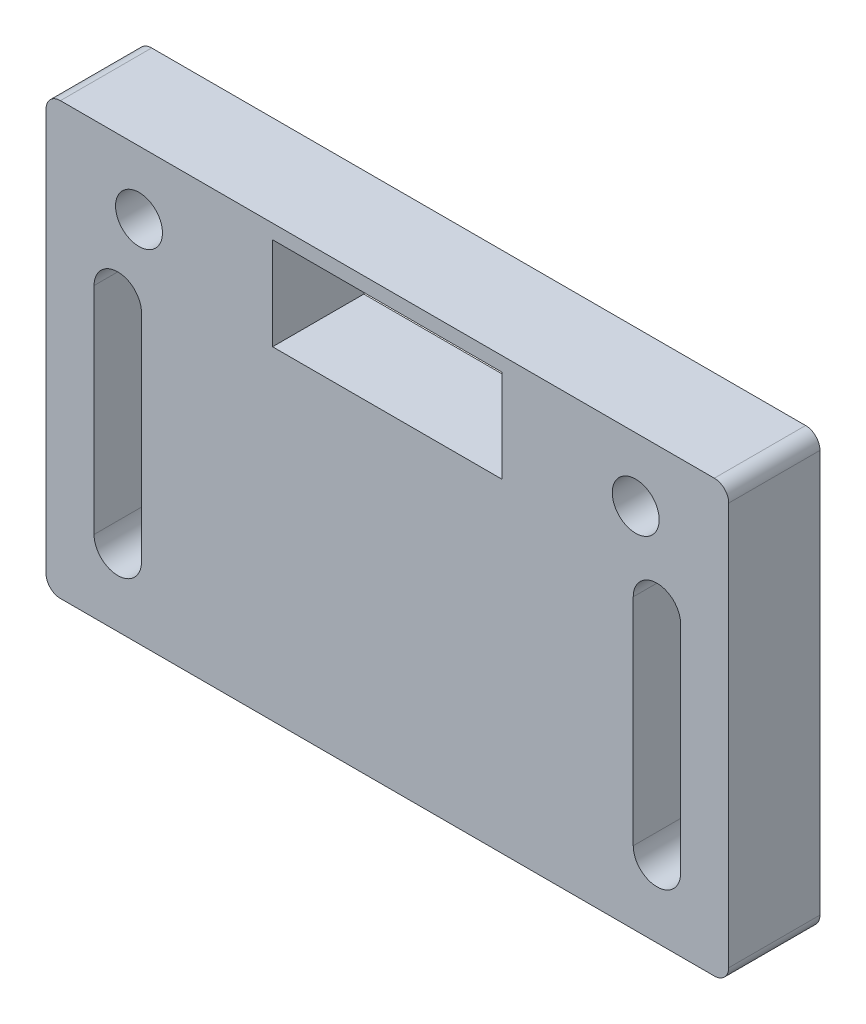
ISO-10303-21;
HEADER;
FILE_DESCRIPTION(('STEP AP214'),'2;1');
FILE_NAME('part.step','',(''),(''),'','','');
FILE_SCHEMA(('AUTOMOTIVE_DESIGN { 1 0 10303 214 1 1 1 1 }'));
ENDSEC;
DATA;
#1=APPLICATION_CONTEXT('core data for automotive mechanical design processes');
#2=APPLICATION_PROTOCOL_DEFINITION('international standard','automotive_design',2000,#1);
#3=PRODUCT_CONTEXT('',#1,'mechanical');
#4=PRODUCT('Part','Part','',(#3));
#5=PRODUCT_RELATED_PRODUCT_CATEGORY('part','',(#4));
#6=PRODUCT_DEFINITION_FORMATION('','',#4);
#7=PRODUCT_DEFINITION_CONTEXT('part definition',#1,'design');
#8=PRODUCT_DEFINITION('design','',#6,#7);
#9=PRODUCT_DEFINITION_SHAPE('','',#8);
#10=(LENGTH_UNIT() NAMED_UNIT(*) SI_UNIT(.MILLI.,.METRE.));
#11=(NAMED_UNIT(*) PLANE_ANGLE_UNIT() SI_UNIT($,.RADIAN.));
#12=(NAMED_UNIT(*) SI_UNIT($,.STERADIAN.) SOLID_ANGLE_UNIT());
#13=UNCERTAINTY_MEASURE_WITH_UNIT(LENGTH_MEASURE(1.E-05),#10,'distance_accuracy_value','');
#14=(GEOMETRIC_REPRESENTATION_CONTEXT(3) GLOBAL_UNCERTAINTY_ASSIGNED_CONTEXT((#13)) GLOBAL_UNIT_ASSIGNED_CONTEXT((#10,
#11,#12)) REPRESENTATION_CONTEXT('',''));
#15=CARTESIAN_POINT('',(0.,0.,0.));
#16=DIRECTION('',(0.,0.,1.));
#17=DIRECTION('',(1.,0.,0.));
#18=AXIS2_PLACEMENT_3D('',#15,#16,#17);
#19=CARTESIAN_POINT('',(0.,0.,0.));
#20=DIRECTION('',(0.,0.,1.));
#21=DIRECTION('',(1.,0.,0.));
#22=AXIS2_PLACEMENT_3D('',#19,#20,#21);
#23=PLANE('',#22);
#24=CARTESIAN_POINT('',(37.515,-19.9408597898144,0.));
#25=DIRECTION('',(0.,0.,-1.));
#26=DIRECTION('',(-1.,0.,0.));
#27=AXIS2_PLACEMENT_3D('',#24,#25,#26);
#28=CIRCLE('',#27,3.3);
#29=CARTESIAN_POINT('',(34.215,-19.9408597898144,0.));
#30=VERTEX_POINT('',#29);
#31=CARTESIAN_POINT('',(40.815,-19.9408597898144,0.));
#32=VERTEX_POINT('',#31);
#33=EDGE_CURVE('E203',#30,#32,#28,.T.);
#34=ORIENTED_EDGE('',*,*,#33,.F.);
#35=DIRECTION('',(0.,1.,0.));
#36=VECTOR('',#35,1.);
#37=CARTESIAN_POINT('',(34.215,0.,0.));
#38=LINE('',#37,#36);
#39=CARTESIAN_POINT('',(34.215,-49.9408597898144,0.));
#40=VERTEX_POINT('',#39);
#41=EDGE_CURVE('E52',#40,#30,#38,.T.);
#42=ORIENTED_EDGE('',*,*,#41,.F.);
#43=CARTESIAN_POINT('',(37.515,-49.9408597898144,0.));
#44=DIRECTION('',(0.,0.,-1.));
#45=DIRECTION('',(-1.,0.,0.));
#46=AXIS2_PLACEMENT_3D('',#43,#44,#45);
#47=CIRCLE('',#46,3.3);
#48=CARTESIAN_POINT('',(40.815,-49.9408597898144,0.));
#49=VERTEX_POINT('',#48);
#50=EDGE_CURVE('E194',#40,#49,#47,.F.);
#51=ORIENTED_EDGE('',*,*,#50,.T.);
#52=DIRECTION('',(0.,-1.,0.));
#53=VECTOR('',#52,1.);
#54=CARTESIAN_POINT('',(40.815,0.,0.));
#55=LINE('',#54,#53);
#56=EDGE_CURVE('E197',#32,#49,#55,.T.);
#57=ORIENTED_EDGE('',*,*,#56,.F.);
#58=EDGE_LOOP('',(#34,#42,#51,#57));
#59=FACE_BOUND('',#58,.T.);
#60=CARTESIAN_POINT('',(-37.515,-19.9408597898144,0.));
#61=DIRECTION('',(0.,0.,-1.));
#62=DIRECTION('',(-1.,0.,0.));
#63=AXIS2_PLACEMENT_3D('',#60,#61,#62);
#64=CIRCLE('',#63,3.3);
#65=CARTESIAN_POINT('',(-40.815,-19.9408597898144,0.));
#66=VERTEX_POINT('',#65);
#67=CARTESIAN_POINT('',(-34.215,-19.9408597898144,0.));
#68=VERTEX_POINT('',#67);
#69=EDGE_CURVE('E229',#66,#68,#64,.T.);
#70=ORIENTED_EDGE('',*,*,#69,.F.);
#71=DIRECTION('',(0.,1.,0.));
#72=VECTOR('',#71,1.);
#73=CARTESIAN_POINT('',(-40.815,0.,0.));
#74=LINE('',#73,#72);
#75=CARTESIAN_POINT('',(-40.815,-49.9408597898144,0.));
#76=VERTEX_POINT('',#75);
#77=EDGE_CURVE('E60',#76,#66,#74,.T.);
#78=ORIENTED_EDGE('',*,*,#77,.F.);
#79=CARTESIAN_POINT('',(-37.515,-49.9408597898144,0.));
#80=DIRECTION('',(0.,0.,-1.));
#81=DIRECTION('',(-1.,0.,0.));
#82=AXIS2_PLACEMENT_3D('',#79,#80,#81);
#83=CIRCLE('',#82,3.3);
#84=CARTESIAN_POINT('',(-34.215,-49.9408597898144,0.));
#85=VERTEX_POINT('',#84);
#86=EDGE_CURVE('E218',#85,#76,#83,.T.);
#87=ORIENTED_EDGE('',*,*,#86,.F.);
#88=DIRECTION('',(0.,1.,0.));
#89=VECTOR('',#88,1.);
#90=CARTESIAN_POINT('',(-34.215,0.,0.));
#91=LINE('',#90,#89);
#92=EDGE_CURVE('E232',#85,#68,#91,.T.);
#93=ORIENTED_EDGE('',*,*,#92,.T.);
#94=EDGE_LOOP('',(#70,#78,#87,#93));
#95=FACE_BOUND('',#94,.T.);
#96=CARTESIAN_POINT('',(34.56,-8.84508661523853,0.));
#97=DIRECTION('',(0.,0.,-1.));
#98=DIRECTION('',(-1.,0.,0.));
#99=AXIS2_PLACEMENT_3D('',#96,#97,#98);
#100=CIRCLE('',#99,6.4389);
#101=CARTESIAN_POINT('',(28.1211,-8.84508661523853,0.));
#102=VERTEX_POINT('',#101);
#103=EDGE_CURVE('E210',#102,#102,#100,.T.);
#104=ORIENTED_EDGE('',*,*,#103,.F.);
#105=EDGE_LOOP('',(#104));
#106=FACE_BOUND('',#105,.T.);
#107=DIRECTION('',(0.,1.,0.));
#108=VECTOR('',#107,1.);
#109=CARTESIAN_POINT('',(47.5,0.,0.));
#110=LINE('',#109,#108);
#111=CARTESIAN_POINT('',(47.5,-58.,0.));
#112=VERTEX_POINT('',#111);
#113=CARTESIAN_POINT('',(47.5,-2.,0.));
#114=VERTEX_POINT('',#113);
#115=EDGE_CURVE('E308',#112,#114,#110,.T.);
#116=ORIENTED_EDGE('',*,*,#115,.F.);
#117=CARTESIAN_POINT('',(45.5,-58.,0.));
#118=DIRECTION('',(0.,0.,1.));
#119=DIRECTION('',(1.,0.,0.));
#120=AXIS2_PLACEMENT_3D('',#117,#118,#119);
#121=CIRCLE('',#120,2.);
#122=CARTESIAN_POINT('',(45.5,-60.,0.));
#123=VERTEX_POINT('',#122);
#124=EDGE_CURVE('E338',#112,#123,#121,.F.);
#125=ORIENTED_EDGE('',*,*,#124,.T.);
#126=DIRECTION('',(1.,0.,0.));
#127=VECTOR('',#126,1.);
#128=CARTESIAN_POINT('',(-47.5,-60.,0.));
#129=LINE('',#128,#127);
#130=CARTESIAN_POINT('',(-45.5,-60.,0.));
#131=VERTEX_POINT('',#130);
#132=EDGE_CURVE('E305',#131,#123,#129,.T.);
#133=ORIENTED_EDGE('',*,*,#132,.F.);
#134=CARTESIAN_POINT('',(-45.5,-58.,0.));
#135=DIRECTION('',(0.,0.,1.));
#136=DIRECTION('',(1.,0.,0.));
#137=AXIS2_PLACEMENT_3D('',#134,#135,#136);
#138=CIRCLE('',#137,2.);
#139=CARTESIAN_POINT('',(-47.5,-58.,0.));
#140=VERTEX_POINT('',#139);
#141=EDGE_CURVE('E316',#131,#140,#138,.F.);
#142=ORIENTED_EDGE('',*,*,#141,.T.);
#143=DIRECTION('',(0.,-1.,0.));
#144=VECTOR('',#143,1.);
#145=CARTESIAN_POINT('',(-47.5,0.,0.));
#146=LINE('',#145,#144);
#147=CARTESIAN_POINT('',(-47.5,-2.,0.));
#148=VERTEX_POINT('',#147);
#149=EDGE_CURVE('E289',#148,#140,#146,.T.);
#150=ORIENTED_EDGE('',*,*,#149,.F.);
#151=CARTESIAN_POINT('',(-45.5,-2.,0.));
#152=DIRECTION('',(0.,0.,1.));
#153=DIRECTION('',(1.,0.,0.));
#154=AXIS2_PLACEMENT_3D('',#151,#152,#153);
#155=CIRCLE('',#154,2.);
#156=CARTESIAN_POINT('',(-45.5,0.,0.));
#157=VERTEX_POINT('',#156);
#158=EDGE_CURVE('E318',#148,#157,#155,.F.);
#159=ORIENTED_EDGE('',*,*,#158,.T.);
#160=DIRECTION('',(-1.,0.,0.));
#161=VECTOR('',#160,1.);
#162=CARTESIAN_POINT('',(-47.5,0.,0.));
#163=LINE('',#162,#161);
#164=CARTESIAN_POINT('',(45.5,0.,0.));
#165=VERTEX_POINT('',#164);
#166=EDGE_CURVE('E294',#165,#157,#163,.T.);
#167=ORIENTED_EDGE('',*,*,#166,.F.);
#168=CARTESIAN_POINT('',(45.5,-2.,0.));
#169=DIRECTION('',(0.,0.,1.));
#170=DIRECTION('',(1.,0.,0.));
#171=AXIS2_PLACEMENT_3D('',#168,#169,#170);
#172=CIRCLE('',#171,2.);
#173=EDGE_CURVE('E336',#165,#114,#172,.F.);
#174=ORIENTED_EDGE('',*,*,#173,.T.);
#175=EDGE_LOOP('',(#116,#125,#133,#142,#150,#159,#167,#174));
#176=FACE_BOUND('',#175,.T.);
#177=DIRECTION('',(0.,-1.,0.));
#178=VECTOR('',#177,1.);
#179=CARTESIAN_POINT('',(-15.975,-14.9,0.));
#180=LINE('',#179,#178);
#181=CARTESIAN_POINT('',(-15.975,-2.,0.));
#182=VERTEX_POINT('',#181);
#183=CARTESIAN_POINT('',(-15.975,-14.9,0.));
#184=VERTEX_POINT('',#183);
#185=EDGE_CURVE('E260',#182,#184,#180,.T.);
#186=ORIENTED_EDGE('',*,*,#185,.T.);
#187=DIRECTION('',(1.,0.,0.));
#188=VECTOR('',#187,1.);
#189=CARTESIAN_POINT('',(15.975,-14.9,0.));
#190=LINE('',#189,#188);
#191=CARTESIAN_POINT('',(15.975,-14.9,0.));
#192=VERTEX_POINT('',#191);
#193=EDGE_CURVE('E274',#184,#192,#190,.T.);
#194=ORIENTED_EDGE('',*,*,#193,.T.);
#195=DIRECTION('',(0.,1.,0.));
#196=VECTOR('',#195,1.);
#197=CARTESIAN_POINT('',(15.975,-2.,0.));
#198=LINE('',#197,#196);
#199=CARTESIAN_POINT('',(15.975,-2.,0.));
#200=VERTEX_POINT('',#199);
#201=EDGE_CURVE('E277',#192,#200,#198,.T.);
#202=ORIENTED_EDGE('',*,*,#201,.T.);
#203=DIRECTION('',(-1.,0.,0.));
#204=VECTOR('',#203,1.);
#205=CARTESIAN_POINT('',(0.,-2.,0.));
#206=LINE('',#205,#204);
#207=EDGE_CURVE('E264',#200,#182,#206,.T.);
#208=ORIENTED_EDGE('',*,*,#207,.T.);
#209=EDGE_LOOP('',(#186,#194,#202,#208));
#210=FACE_BOUND('',#209,.T.);
#211=CARTESIAN_POINT('',(-34.56,-8.84508661523853,0.));
#212=DIRECTION('',(0.,0.,-1.));
#213=DIRECTION('',(-1.,0.,0.));
#214=AXIS2_PLACEMENT_3D('',#211,#212,#213);
#215=CIRCLE('',#214,6.4389);
#216=CARTESIAN_POINT('',(-40.9989,-8.84508661523853,0.));
#217=VERTEX_POINT('',#216);
#218=EDGE_CURVE('E251',#217,#217,#215,.T.);
#219=ORIENTED_EDGE('',*,*,#218,.F.);
#220=EDGE_LOOP('',(#219));
#221=FACE_BOUND('',#220,.T.);
#222=ADVANCED_FACE('F37',(#59,#95,#106,#176,#210,#221),#23,.F.);
#223=CARTESIAN_POINT('',(0.,0.,12.7));
#224=DIRECTION('',(0.,0.,1.));
#225=DIRECTION('',(1.,0.,0.));
#226=AXIS2_PLACEMENT_3D('',#223,#224,#225);
#227=PLANE('',#226);
#228=DIRECTION('',(0.,1.,0.));
#229=VECTOR('',#228,1.);
#230=CARTESIAN_POINT('',(34.215,0.,12.7));
#231=LINE('',#230,#229);
#232=CARTESIAN_POINT('',(34.215,-49.9408597898144,12.7));
#233=VERTEX_POINT('',#232);
#234=CARTESIAN_POINT('',(34.215,-19.9408597898144,12.7));
#235=VERTEX_POINT('',#234);
#236=EDGE_CURVE('E176',#233,#235,#231,.T.);
#237=ORIENTED_EDGE('',*,*,#236,.T.);
#238=CARTESIAN_POINT('',(37.515,-19.9408597898144,12.7));
#239=DIRECTION('',(0.,0.,-1.));
#240=DIRECTION('',(-1.,0.,0.));
#241=AXIS2_PLACEMENT_3D('',#238,#239,#240);
#242=CIRCLE('',#241,3.3);
#243=CARTESIAN_POINT('',(40.815,-19.9408597898144,12.7));
#244=VERTEX_POINT('',#243);
#245=EDGE_CURVE('E186',#235,#244,#242,.T.);
#246=ORIENTED_EDGE('',*,*,#245,.T.);
#247=DIRECTION('',(0.,-1.,0.));
#248=VECTOR('',#247,1.);
#249=CARTESIAN_POINT('',(40.815,0.,12.7));
#250=LINE('',#249,#248);
#251=CARTESIAN_POINT('',(40.815,-49.9408597898144,12.7));
#252=VERTEX_POINT('',#251);
#253=EDGE_CURVE('E190',#244,#252,#250,.T.);
#254=ORIENTED_EDGE('',*,*,#253,.T.);
#255=CARTESIAN_POINT('',(37.515,-49.9408597898144,12.7));
#256=DIRECTION('',(0.,0.,-1.));
#257=DIRECTION('',(-1.,0.,0.));
#258=AXIS2_PLACEMENT_3D('',#255,#256,#257);
#259=CIRCLE('',#258,3.3);
#260=EDGE_CURVE('E182',#233,#252,#259,.F.);
#261=ORIENTED_EDGE('',*,*,#260,.F.);
#262=EDGE_LOOP('',(#237,#246,#254,#261));
#263=FACE_BOUND('',#262,.T.);
#264=DIRECTION('',(0.,1.,0.));
#265=VECTOR('',#264,1.);
#266=CARTESIAN_POINT('',(-40.815,0.,12.7));
#267=LINE('',#266,#265);
#268=CARTESIAN_POINT('',(-40.815,-49.9408597898144,12.7));
#269=VERTEX_POINT('',#268);
#270=CARTESIAN_POINT('',(-40.815,-19.9408597898144,12.7));
#271=VERTEX_POINT('',#270);
#272=EDGE_CURVE('E214',#269,#271,#267,.T.);
#273=ORIENTED_EDGE('',*,*,#272,.T.);
#274=CARTESIAN_POINT('',(-37.515,-19.9408597898144,12.7));
#275=DIRECTION('',(0.,0.,-1.));
#276=DIRECTION('',(-1.,0.,0.));
#277=AXIS2_PLACEMENT_3D('',#274,#275,#276);
#278=CIRCLE('',#277,3.3);
#279=CARTESIAN_POINT('',(-34.215,-19.9408597898144,12.7));
#280=VERTEX_POINT('',#279);
#281=EDGE_CURVE('E217',#271,#280,#278,.T.);
#282=ORIENTED_EDGE('',*,*,#281,.T.);
#283=DIRECTION('',(0.,1.,0.));
#284=VECTOR('',#283,1.);
#285=CARTESIAN_POINT('',(-34.215,0.,12.7));
#286=LINE('',#285,#284);
#287=CARTESIAN_POINT('',(-34.215,-49.9408597898144,12.7));
#288=VERTEX_POINT('',#287);
#289=EDGE_CURVE('E221',#288,#280,#286,.T.);
#290=ORIENTED_EDGE('',*,*,#289,.F.);
#291=CARTESIAN_POINT('',(-37.515,-49.9408597898144,12.7));
#292=DIRECTION('',(0.,0.,-1.));
#293=DIRECTION('',(-1.,0.,0.));
#294=AXIS2_PLACEMENT_3D('',#291,#292,#293);
#295=CIRCLE('',#294,3.3);
#296=EDGE_CURVE('E224',#288,#269,#295,.T.);
#297=ORIENTED_EDGE('',*,*,#296,.T.);
#298=EDGE_LOOP('',(#273,#282,#290,#297));
#299=FACE_BOUND('',#298,.T.);
#300=CARTESIAN_POINT('',(34.56,-8.84508661523853,12.7));
#301=DIRECTION('',(0.,0.,-1.));
#302=DIRECTION('',(-1.,0.,0.));
#303=AXIS2_PLACEMENT_3D('',#300,#301,#302);
#304=CIRCLE('',#303,3.26389999999999);
#305=CARTESIAN_POINT('',(31.2961,-8.84508661523853,12.7));
#306=VERTEX_POINT('',#305);
#307=EDGE_CURVE('E248',#306,#306,#304,.T.);
#308=ORIENTED_EDGE('',*,*,#307,.T.);
#309=EDGE_LOOP('',(#308));
#310=FACE_BOUND('',#309,.T.);
#311=CARTESIAN_POINT('',(-34.56,-8.84508661523853,12.7));
#312=DIRECTION('',(0.,0.,-1.));
#313=DIRECTION('',(-1.,0.,0.));
#314=AXIS2_PLACEMENT_3D('',#311,#312,#313);
#315=CIRCLE('',#314,3.26389999999999);
#316=CARTESIAN_POINT('',(-37.8239,-8.84508661523853,12.7));
#317=VERTEX_POINT('',#316);
#318=EDGE_CURVE('E257',#317,#317,#315,.T.);
#319=ORIENTED_EDGE('',*,*,#318,.T.);
#320=EDGE_LOOP('',(#319));
#321=FACE_BOUND('',#320,.T.);
#322=DIRECTION('',(1.,0.,0.));
#323=VECTOR('',#322,1.);
#324=CARTESIAN_POINT('',(-47.5,-60.,12.7));
#325=LINE('',#324,#323);
#326=CARTESIAN_POINT('',(-45.5,-60.,12.7));
#327=VERTEX_POINT('',#326);
#328=CARTESIAN_POINT('',(45.5,-60.,12.7));
#329=VERTEX_POINT('',#328);
#330=EDGE_CURVE('E293',#327,#329,#325,.T.);
#331=ORIENTED_EDGE('',*,*,#330,.T.);
#332=CARTESIAN_POINT('',(45.5,-58.,12.7));
#333=DIRECTION('',(0.,0.,1.));
#334=DIRECTION('',(1.,0.,0.));
#335=AXIS2_PLACEMENT_3D('',#332,#333,#334);
#336=CIRCLE('',#335,2.);
#337=CARTESIAN_POINT('',(47.5,-58.,12.7));
#338=VERTEX_POINT('',#337);
#339=EDGE_CURVE('E45',#329,#338,#336,.T.);
#340=ORIENTED_EDGE('',*,*,#339,.T.);
#341=DIRECTION('',(0.,1.,0.));
#342=VECTOR('',#341,1.);
#343=CARTESIAN_POINT('',(47.5,0.,12.7));
#344=LINE('',#343,#342);
#345=CARTESIAN_POINT('',(47.5,-2.,12.7));
#346=VERTEX_POINT('',#345);
#347=EDGE_CURVE('E297',#338,#346,#344,.T.);
#348=ORIENTED_EDGE('',*,*,#347,.T.);
#349=CARTESIAN_POINT('',(45.5,-2.,12.7));
#350=DIRECTION('',(0.,0.,1.));
#351=DIRECTION('',(1.,0.,0.));
#352=AXIS2_PLACEMENT_3D('',#349,#350,#351);
#353=CIRCLE('',#352,2.);
#354=CARTESIAN_POINT('',(45.5,0.,12.7));
#355=VERTEX_POINT('',#354);
#356=EDGE_CURVE('E342',#346,#355,#353,.T.);
#357=ORIENTED_EDGE('',*,*,#356,.T.);
#358=DIRECTION('',(-1.,0.,0.));
#359=VECTOR('',#358,1.);
#360=CARTESIAN_POINT('',(-47.5,0.,12.7));
#361=LINE('',#360,#359);
#362=CARTESIAN_POINT('',(-45.5,0.,12.7));
#363=VERTEX_POINT('',#362);
#364=EDGE_CURVE('E300',#355,#363,#361,.T.);
#365=ORIENTED_EDGE('',*,*,#364,.T.);
#366=CARTESIAN_POINT('',(-45.5,-2.,12.7));
#367=DIRECTION('',(0.,0.,1.));
#368=DIRECTION('',(1.,0.,0.));
#369=AXIS2_PLACEMENT_3D('',#366,#367,#368);
#370=CIRCLE('',#369,2.);
#371=CARTESIAN_POINT('',(-47.5,-2.,12.7));
#372=VERTEX_POINT('',#371);
#373=EDGE_CURVE('E326',#363,#372,#370,.T.);
#374=ORIENTED_EDGE('',*,*,#373,.T.);
#375=DIRECTION('',(0.,-1.,0.));
#376=VECTOR('',#375,1.);
#377=CARTESIAN_POINT('',(-47.5,0.,12.7));
#378=LINE('',#377,#376);
#379=CARTESIAN_POINT('',(-47.5,-58.,12.7));
#380=VERTEX_POINT('',#379);
#381=EDGE_CURVE('E290',#372,#380,#378,.T.);
#382=ORIENTED_EDGE('',*,*,#381,.T.);
#383=CARTESIAN_POINT('',(-45.5,-58.,12.7));
#384=DIRECTION('',(0.,0.,1.));
#385=DIRECTION('',(1.,0.,0.));
#386=AXIS2_PLACEMENT_3D('',#383,#384,#385);
#387=CIRCLE('',#386,2.);
#388=EDGE_CURVE('E324',#380,#327,#387,.T.);
#389=ORIENTED_EDGE('',*,*,#388,.T.);
#390=EDGE_LOOP('',(#331,#340,#348,#357,#365,#374,#382,#389));
#391=FACE_BOUND('',#390,.T.);
#392=DIRECTION('',(1.,0.,0.));
#393=VECTOR('',#392,1.);
#394=CARTESIAN_POINT('',(15.975,-14.9,12.7));
#395=LINE('',#394,#393);
#396=CARTESIAN_POINT('',(-15.975,-14.9,12.7));
#397=VERTEX_POINT('',#396);
#398=CARTESIAN_POINT('',(15.975,-14.9,12.7));
#399=VERTEX_POINT('',#398);
#400=EDGE_CURVE('E266',#397,#399,#395,.T.);
#401=ORIENTED_EDGE('',*,*,#400,.F.);
#402=DIRECTION('',(0.,-1.,0.));
#403=VECTOR('',#402,1.);
#404=CARTESIAN_POINT('',(-15.975,-14.9,12.7));
#405=LINE('',#404,#403);
#406=CARTESIAN_POINT('',(-15.975,-2.,12.7));
#407=VERTEX_POINT('',#406);
#408=EDGE_CURVE('E263',#407,#397,#405,.T.);
#409=ORIENTED_EDGE('',*,*,#408,.F.);
#410=DIRECTION('',(-1.,0.,0.));
#411=VECTOR('',#410,1.);
#412=CARTESIAN_POINT('',(-15.975,-2.,12.7));
#413=LINE('',#412,#411);
#414=CARTESIAN_POINT('',(15.975,-2.,12.7));
#415=VERTEX_POINT('',#414);
#416=EDGE_CURVE('E261',#415,#407,#413,.T.);
#417=ORIENTED_EDGE('',*,*,#416,.F.);
#418=DIRECTION('',(0.,1.,0.));
#419=VECTOR('',#418,1.);
#420=CARTESIAN_POINT('',(15.975,-2.,12.7));
#421=LINE('',#420,#419);
#422=EDGE_CURVE('E268',#399,#415,#421,.T.);
#423=ORIENTED_EDGE('',*,*,#422,.F.);
#424=EDGE_LOOP('',(#401,#409,#417,#423));
#425=FACE_BOUND('',#424,.T.);
#426=ADVANCED_FACE('F192',(#263,#299,#310,#321,#391,#425),#227,.T.);
#427=CARTESIAN_POINT('',(-47.5,0.,12.7));
#428=DIRECTION('',(1.,0.,0.));
#429=DIRECTION('',(0.,1.,0.));
#430=AXIS2_PLACEMENT_3D('',#427,#428,#429);
#431=PLANE('',#430);
#432=ORIENTED_EDGE('',*,*,#381,.F.);
#433=DIRECTION('',(0.,0.,-1.));
#434=VECTOR('',#433,1.);
#435=CARTESIAN_POINT('',(-47.5,-2.,12.7));
#436=LINE('',#435,#434);
#437=EDGE_CURVE('E313',#372,#148,#436,.T.);
#438=ORIENTED_EDGE('',*,*,#437,.T.);
#439=ORIENTED_EDGE('',*,*,#149,.T.);
#440=DIRECTION('',(0.,0.,-1.));
#441=VECTOR('',#440,1.);
#442=CARTESIAN_POINT('',(-47.5,-58.,12.7));
#443=LINE('',#442,#441);
#444=EDGE_CURVE('E302',#140,#380,#443,.F.);
#445=ORIENTED_EDGE('',*,*,#444,.T.);
#446=EDGE_LOOP('',(#432,#438,#439,#445));
#447=FACE_BOUND('',#446,.T.);
#448=ADVANCED_FACE('F370',(#447),#431,.F.);
#449=CARTESIAN_POINT('',(-47.5,-60.,12.7));
#450=DIRECTION('',(0.,1.,0.));
#451=DIRECTION('',(0.,0.,1.));
#452=AXIS2_PLACEMENT_3D('',#449,#450,#451);
#453=PLANE('',#452);
#454=ORIENTED_EDGE('',*,*,#132,.T.);
#455=DIRECTION('',(0.,0.,-1.));
#456=VECTOR('',#455,1.);
#457=CARTESIAN_POINT('',(45.5,-60.,12.7));
#458=LINE('',#457,#456);
#459=EDGE_CURVE('E340',#123,#329,#458,.F.);
#460=ORIENTED_EDGE('',*,*,#459,.T.);
#461=ORIENTED_EDGE('',*,*,#330,.F.);
#462=DIRECTION('',(0.,0.,-1.));
#463=VECTOR('',#462,1.);
#464=CARTESIAN_POINT('',(-45.5,-60.,12.7));
#465=LINE('',#464,#463);
#466=EDGE_CURVE('E328',#327,#131,#465,.T.);
#467=ORIENTED_EDGE('',*,*,#466,.T.);
#468=EDGE_LOOP('',(#454,#460,#461,#467));
#469=FACE_BOUND('',#468,.T.);
#470=ADVANCED_FACE('F361',(#469),#453,.F.);
#471=CARTESIAN_POINT('',(47.5,0.,12.7));
#472=DIRECTION('',(-1.,0.,0.));
#473=DIRECTION('',(0.,-1.,0.));
#474=AXIS2_PLACEMENT_3D('',#471,#472,#473);
#475=PLANE('',#474);
#476=ORIENTED_EDGE('',*,*,#347,.F.);
#477=DIRECTION('',(0.,0.,-1.));
#478=VECTOR('',#477,1.);
#479=CARTESIAN_POINT('',(47.5,-58.,12.7));
#480=LINE('',#479,#478);
#481=EDGE_CURVE('E333',#338,#112,#480,.T.);
#482=ORIENTED_EDGE('',*,*,#481,.T.);
#483=ORIENTED_EDGE('',*,*,#115,.T.);
#484=DIRECTION('',(0.,0.,-1.));
#485=VECTOR('',#484,1.);
#486=CARTESIAN_POINT('',(47.5,-2.,12.7));
#487=LINE('',#486,#485);
#488=EDGE_CURVE('E331',#114,#346,#487,.F.);
#489=ORIENTED_EDGE('',*,*,#488,.T.);
#490=EDGE_LOOP('',(#476,#482,#483,#489));
#491=FACE_BOUND('',#490,.T.);
#492=ADVANCED_FACE('F353',(#491),#475,.F.);
#493=CARTESIAN_POINT('',(-47.5,0.,12.7));
#494=DIRECTION('',(0.,-1.,0.));
#495=DIRECTION('',(0.,0.,-1.));
#496=AXIS2_PLACEMENT_3D('',#493,#494,#495);
#497=PLANE('',#496);
#498=ORIENTED_EDGE('',*,*,#364,.F.);
#499=DIRECTION('',(0.,0.,-1.));
#500=VECTOR('',#499,1.);
#501=CARTESIAN_POINT('',(45.5,0.,12.7));
#502=LINE('',#501,#500);
#503=EDGE_CURVE('E11',#355,#165,#502,.T.);
#504=ORIENTED_EDGE('',*,*,#503,.T.);
#505=ORIENTED_EDGE('',*,*,#166,.T.);
#506=DIRECTION('',(0.,0.,-1.));
#507=VECTOR('',#506,1.);
#508=CARTESIAN_POINT('',(-45.5,0.,12.7));
#509=LINE('',#508,#507);
#510=EDGE_CURVE('E321',#157,#363,#509,.F.);
#511=ORIENTED_EDGE('',*,*,#510,.T.);
#512=EDGE_LOOP('',(#498,#504,#505,#511));
#513=FACE_BOUND('',#512,.T.);
#514=ADVANCED_FACE('F379',(#513),#497,.F.);
#515=CARTESIAN_POINT('',(-15.975,-14.9,12.7));
#516=DIRECTION('',(1.,0.,0.));
#517=DIRECTION('',(0.,0.,-1.));
#518=AXIS2_PLACEMENT_3D('',#515,#516,#517);
#519=PLANE('',#518);
#520=ORIENTED_EDGE('',*,*,#185,.F.);
#521=DIRECTION('',(0.,0.,-1.));
#522=VECTOR('',#521,1.);
#523=CARTESIAN_POINT('',(-15.975,-2.,12.7));
#524=LINE('',#523,#522);
#525=EDGE_CURVE('E287',#407,#182,#524,.T.);
#526=ORIENTED_EDGE('',*,*,#525,.F.);
#527=ORIENTED_EDGE('',*,*,#408,.T.);
#528=DIRECTION('',(0.,0.,-1.));
#529=VECTOR('',#528,1.);
#530=CARTESIAN_POINT('',(-15.975,-14.9,12.7));
#531=LINE('',#530,#529);
#532=EDGE_CURVE('E285',#397,#184,#531,.T.);
#533=ORIENTED_EDGE('',*,*,#532,.T.);
#534=EDGE_LOOP('',(#520,#526,#527,#533));
#535=FACE_BOUND('',#534,.T.);
#536=ADVANCED_FACE('F402',(#535),#519,.T.);
#537=CARTESIAN_POINT('',(15.975,-14.9,12.7));
#538=DIRECTION('',(0.,1.,0.));
#539=DIRECTION('',(-1.,0.,0.));
#540=AXIS2_PLACEMENT_3D('',#537,#538,#539);
#541=PLANE('',#540);
#542=ORIENTED_EDGE('',*,*,#193,.F.);
#543=ORIENTED_EDGE('',*,*,#532,.F.);
#544=ORIENTED_EDGE('',*,*,#400,.T.);
#545=DIRECTION('',(0.,0.,-1.));
#546=VECTOR('',#545,1.);
#547=CARTESIAN_POINT('',(15.975,-14.9,12.7));
#548=LINE('',#547,#546);
#549=EDGE_CURVE('E283',#399,#192,#548,.T.);
#550=ORIENTED_EDGE('',*,*,#549,.T.);
#551=EDGE_LOOP('',(#542,#543,#544,#550));
#552=FACE_BOUND('',#551,.T.);
#553=ADVANCED_FACE('F541',(#552),#541,.T.);
#554=CARTESIAN_POINT('',(15.975,-2.,12.7));
#555=DIRECTION('',(-1.,0.,0.));
#556=DIRECTION('',(0.,-1.,0.));
#557=AXIS2_PLACEMENT_3D('',#554,#555,#556);
#558=PLANE('',#557);
#559=ORIENTED_EDGE('',*,*,#201,.F.);
#560=ORIENTED_EDGE('',*,*,#549,.F.);
#561=ORIENTED_EDGE('',*,*,#422,.T.);
#562=DIRECTION('',(0.,0.,-1.));
#563=VECTOR('',#562,1.);
#564=CARTESIAN_POINT('',(15.975,-2.,12.7));
#565=LINE('',#564,#563);
#566=EDGE_CURVE('E271',#415,#200,#565,.T.);
#567=ORIENTED_EDGE('',*,*,#566,.T.);
#568=EDGE_LOOP('',(#559,#560,#561,#567));
#569=FACE_BOUND('',#568,.T.);
#570=ADVANCED_FACE('F537',(#569),#558,.T.);
#571=CARTESIAN_POINT('',(0.,-2.,12.7));
#572=DIRECTION('',(0.,-1.,0.));
#573=DIRECTION('',(0.,0.,-1.));
#574=AXIS2_PLACEMENT_3D('',#571,#572,#573);
#575=PLANE('',#574);
#576=ORIENTED_EDGE('',*,*,#207,.F.);
#577=ORIENTED_EDGE('',*,*,#566,.F.);
#578=ORIENTED_EDGE('',*,*,#416,.T.);
#579=ORIENTED_EDGE('',*,*,#525,.T.);
#580=EDGE_LOOP('',(#576,#577,#578,#579));
#581=FACE_BOUND('',#580,.T.);
#582=ADVANCED_FACE('F533',(#581),#575,.T.);
#583=CARTESIAN_POINT('',(-34.56,-8.84508661523853,0.));
#584=DIRECTION('',(0.,0.,-1.));
#585=DIRECTION('',(-1.,0.,0.));
#586=AXIS2_PLACEMENT_3D('',#583,#584,#585);
#587=CYLINDRICAL_SURFACE('',#586,3.26389999999999);
#588=ORIENTED_EDGE('',*,*,#318,.F.);
#589=EDGE_LOOP('',(#588));
#590=FACE_BOUND('',#589,.T.);
#591=CARTESIAN_POINT('',(-34.56,-8.84508661523853,3.65241969292671));
#592=DIRECTION('',(0.,0.,-1.));
#593=DIRECTION('',(-1.,0.,0.));
#594=AXIS2_PLACEMENT_3D('',#591,#592,#593);
#595=CIRCLE('',#594,3.26389999999999);
#596=CARTESIAN_POINT('',(-37.8239,-8.84508661523853,3.65241969292671));
#597=VERTEX_POINT('',#596);
#598=EDGE_CURVE('E254',#597,#597,#595,.T.);
#599=ORIENTED_EDGE('',*,*,#598,.T.);
#600=EDGE_LOOP('',(#599));
#601=FACE_BOUND('',#600,.T.);
#602=ADVANCED_FACE('F529',(#590,#601),#587,.F.);
#603=CARTESIAN_POINT('',(-34.56,-8.84508661523853,0.));
#604=DIRECTION('',(0.,0.,-1.));
#605=DIRECTION('',(-1.,0.,0.));
#606=AXIS2_PLACEMENT_3D('',#603,#604,#605);
#607=CONICAL_SURFACE('',#606,6.4389,0.715584993317677);
#608=ORIENTED_EDGE('',*,*,#598,.F.);
#609=EDGE_LOOP('',(#608));
#610=FACE_BOUND('',#609,.T.);
#611=ORIENTED_EDGE('',*,*,#218,.T.);
#612=EDGE_LOOP('',(#611));
#613=FACE_BOUND('',#612,.T.);
#614=ADVANCED_FACE('F525',(#610,#613),#607,.F.);
#615=CARTESIAN_POINT('',(34.56,-8.84508661523853,0.));
#616=DIRECTION('',(0.,0.,-1.));
#617=DIRECTION('',(-1.,0.,0.));
#618=AXIS2_PLACEMENT_3D('',#615,#616,#617);
#619=CYLINDRICAL_SURFACE('',#618,3.26389999999999);
#620=ORIENTED_EDGE('',*,*,#307,.F.);
#621=EDGE_LOOP('',(#620));
#622=FACE_BOUND('',#621,.T.);
#623=CARTESIAN_POINT('',(34.56,-8.84508661523853,3.65241969292671));
#624=DIRECTION('',(0.,0.,-1.));
#625=DIRECTION('',(-1.,0.,0.));
#626=AXIS2_PLACEMENT_3D('',#623,#624,#625);
#627=CIRCLE('',#626,3.26389999999999);
#628=CARTESIAN_POINT('',(31.2961,-8.84508661523853,3.65241969292671));
#629=VERTEX_POINT('',#628);
#630=EDGE_CURVE('E245',#629,#629,#627,.T.);
#631=ORIENTED_EDGE('',*,*,#630,.T.);
#632=EDGE_LOOP('',(#631));
#633=FACE_BOUND('',#632,.T.);
#634=ADVANCED_FACE('F521',(#622,#633),#619,.F.);
#635=CARTESIAN_POINT('',(34.56,-8.84508661523853,0.));
#636=DIRECTION('',(0.,0.,-1.));
#637=DIRECTION('',(-1.,0.,0.));
#638=AXIS2_PLACEMENT_3D('',#635,#636,#637);
#639=CONICAL_SURFACE('',#638,6.4389,0.715584993317678);
#640=ORIENTED_EDGE('',*,*,#630,.F.);
#641=EDGE_LOOP('',(#640));
#642=FACE_BOUND('',#641,.T.);
#643=ORIENTED_EDGE('',*,*,#103,.T.);
#644=EDGE_LOOP('',(#643));
#645=FACE_BOUND('',#644,.T.);
#646=ADVANCED_FACE('F411',(#642,#645),#639,.F.);
#647=CARTESIAN_POINT('',(-45.5,-2.,12.7));
#648=DIRECTION('',(0.,0.,-1.));
#649=DIRECTION('',(-1.,0.,0.));
#650=AXIS2_PLACEMENT_3D('',#647,#648,#649);
#651=CYLINDRICAL_SURFACE('',#650,2.);
#652=ORIENTED_EDGE('',*,*,#373,.F.);
#653=ORIENTED_EDGE('',*,*,#510,.F.);
#654=ORIENTED_EDGE('',*,*,#158,.F.);
#655=ORIENTED_EDGE('',*,*,#437,.F.);
#656=EDGE_LOOP('',(#652,#653,#654,#655));
#657=FACE_BOUND('',#656,.T.);
#658=ADVANCED_FACE('F374',(#657),#651,.T.);
#659=CARTESIAN_POINT('',(-45.5,-58.,12.7));
#660=DIRECTION('',(0.,0.,-1.));
#661=DIRECTION('',(-1.,0.,0.));
#662=AXIS2_PLACEMENT_3D('',#659,#660,#661);
#663=CYLINDRICAL_SURFACE('',#662,2.);
#664=ORIENTED_EDGE('',*,*,#388,.F.);
#665=ORIENTED_EDGE('',*,*,#444,.F.);
#666=ORIENTED_EDGE('',*,*,#141,.F.);
#667=ORIENTED_EDGE('',*,*,#466,.F.);
#668=EDGE_LOOP('',(#664,#665,#666,#667));
#669=FACE_BOUND('',#668,.T.);
#670=ADVANCED_FACE('F365',(#669),#663,.T.);
#671=CARTESIAN_POINT('',(45.5,-58.,12.7));
#672=DIRECTION('',(0.,0.,-1.));
#673=DIRECTION('',(-1.,0.,0.));
#674=AXIS2_PLACEMENT_3D('',#671,#672,#673);
#675=CYLINDRICAL_SURFACE('',#674,2.);
#676=ORIENTED_EDGE('',*,*,#339,.F.);
#677=ORIENTED_EDGE('',*,*,#459,.F.);
#678=ORIENTED_EDGE('',*,*,#124,.F.);
#679=ORIENTED_EDGE('',*,*,#481,.F.);
#680=EDGE_LOOP('',(#676,#677,#678,#679));
#681=FACE_BOUND('',#680,.T.);
#682=ADVANCED_FACE('F356',(#681),#675,.T.);
#683=CARTESIAN_POINT('',(45.5,-2.,12.7));
#684=DIRECTION('',(0.,0.,-1.));
#685=DIRECTION('',(-1.,0.,0.));
#686=AXIS2_PLACEMENT_3D('',#683,#684,#685);
#687=CYLINDRICAL_SURFACE('',#686,2.);
#688=ORIENTED_EDGE('',*,*,#356,.F.);
#689=ORIENTED_EDGE('',*,*,#488,.F.);
#690=ORIENTED_EDGE('',*,*,#173,.F.);
#691=ORIENTED_EDGE('',*,*,#503,.F.);
#692=EDGE_LOOP('',(#688,#689,#690,#691));
#693=FACE_BOUND('',#692,.T.);
#694=ADVANCED_FACE('F39',(#693),#687,.T.);
#695=CARTESIAN_POINT('',(-40.815,0.,12.7));
#696=DIRECTION('',(-1.,0.,0.));
#697=DIRECTION('',(0.,0.,1.));
#698=AXIS2_PLACEMENT_3D('',#695,#696,#697);
#699=PLANE('',#698);
#700=ORIENTED_EDGE('',*,*,#77,.T.);
#701=DIRECTION('',(0.,0.,-1.));
#702=VECTOR('',#701,1.);
#703=CARTESIAN_POINT('',(-40.815,-19.9408597898144,12.7));
#704=LINE('',#703,#702);
#705=EDGE_CURVE('E227',#271,#66,#704,.T.);
#706=ORIENTED_EDGE('',*,*,#705,.F.);
#707=ORIENTED_EDGE('',*,*,#272,.F.);
#708=DIRECTION('',(0.,0.,-1.));
#709=VECTOR('',#708,1.);
#710=CARTESIAN_POINT('',(-40.815,-49.9408597898144,12.7));
#711=LINE('',#710,#709);
#712=EDGE_CURVE('E204',#269,#76,#711,.T.);
#713=ORIENTED_EDGE('',*,*,#712,.T.);
#714=EDGE_LOOP('',(#700,#706,#707,#713));
#715=FACE_BOUND('',#714,.T.);
#716=ADVANCED_FACE('F383',(#715),#699,.F.);
#717=CARTESIAN_POINT('',(-37.515,-49.9408597898144,12.7));
#718=DIRECTION('',(0.,0.,-1.));
#719=DIRECTION('',(-1.,0.,0.));
#720=AXIS2_PLACEMENT_3D('',#717,#718,#719);
#721=CYLINDRICAL_SURFACE('',#720,3.3);
#722=ORIENTED_EDGE('',*,*,#86,.T.);
#723=ORIENTED_EDGE('',*,*,#712,.F.);
#724=ORIENTED_EDGE('',*,*,#296,.F.);
#725=DIRECTION('',(0.,0.,-1.));
#726=VECTOR('',#725,1.);
#727=CARTESIAN_POINT('',(-34.215,-49.9408597898144,12.7));
#728=LINE('',#727,#726);
#729=EDGE_CURVE('E238',#288,#85,#728,.T.);
#730=ORIENTED_EDGE('',*,*,#729,.T.);
#731=EDGE_LOOP('',(#722,#723,#724,#730));
#732=FACE_BOUND('',#731,.T.);
#733=ADVANCED_FACE('F388',(#732),#721,.F.);
#734=CARTESIAN_POINT('',(-34.215,0.,12.7));
#735=DIRECTION('',(-1.,0.,0.));
#736=DIRECTION('',(0.,0.,1.));
#737=AXIS2_PLACEMENT_3D('',#734,#735,#736);
#738=PLANE('',#737);
#739=ORIENTED_EDGE('',*,*,#92,.F.);
#740=ORIENTED_EDGE('',*,*,#729,.F.);
#741=ORIENTED_EDGE('',*,*,#289,.T.);
#742=DIRECTION('',(0.,0.,-1.));
#743=VECTOR('',#742,1.);
#744=CARTESIAN_POINT('',(-34.215,-19.9408597898144,12.7));
#745=LINE('',#744,#743);
#746=EDGE_CURVE('E240',#280,#68,#745,.T.);
#747=ORIENTED_EDGE('',*,*,#746,.T.);
#748=EDGE_LOOP('',(#739,#740,#741,#747));
#749=FACE_BOUND('',#748,.T.);
#750=ADVANCED_FACE('F459',(#749),#738,.T.);
#751=CARTESIAN_POINT('',(-37.515,-19.9408597898144,12.7));
#752=DIRECTION('',(0.,0.,-1.));
#753=DIRECTION('',(-1.,0.,0.));
#754=AXIS2_PLACEMENT_3D('',#751,#752,#753);
#755=CYLINDRICAL_SURFACE('',#754,3.3);
#756=ORIENTED_EDGE('',*,*,#69,.T.);
#757=ORIENTED_EDGE('',*,*,#746,.F.);
#758=ORIENTED_EDGE('',*,*,#281,.F.);
#759=ORIENTED_EDGE('',*,*,#705,.T.);
#760=EDGE_LOOP('',(#756,#757,#758,#759));
#761=FACE_BOUND('',#760,.T.);
#762=ADVANCED_FACE('F469',(#761),#755,.F.);
#763=CARTESIAN_POINT('',(34.215,0.,12.7));
#764=DIRECTION('',(-1.,0.,0.));
#765=DIRECTION('',(0.,0.,1.));
#766=AXIS2_PLACEMENT_3D('',#763,#764,#765);
#767=PLANE('',#766);
#768=ORIENTED_EDGE('',*,*,#41,.T.);
#769=DIRECTION('',(0.,0.,-1.));
#770=VECTOR('',#769,1.);
#771=CARTESIAN_POINT('',(34.215,-19.9408597898144,12.7));
#772=LINE('',#771,#770);
#773=EDGE_CURVE('E172',#235,#30,#772,.T.);
#774=ORIENTED_EDGE('',*,*,#773,.F.);
#775=ORIENTED_EDGE('',*,*,#236,.F.);
#776=DIRECTION('',(0.,0.,-1.));
#777=VECTOR('',#776,1.);
#778=CARTESIAN_POINT('',(34.215,-49.9408597898144,12.7));
#779=LINE('',#778,#777);
#780=EDGE_CURVE('E208',#233,#40,#779,.T.);
#781=ORIENTED_EDGE('',*,*,#780,.T.);
#782=EDGE_LOOP('',(#768,#774,#775,#781));
#783=FACE_BOUND('',#782,.T.);
#784=ADVANCED_FACE('F174',(#783),#767,.F.);
#785=CARTESIAN_POINT('',(37.515,-49.9408597898144,12.7));
#786=DIRECTION('',(0.,0.,-1.));
#787=DIRECTION('',(-1.,0.,0.));
#788=AXIS2_PLACEMENT_3D('',#785,#786,#787);
#789=CYLINDRICAL_SURFACE('',#788,3.3);
#790=ORIENTED_EDGE('',*,*,#50,.F.);
#791=ORIENTED_EDGE('',*,*,#780,.F.);
#792=ORIENTED_EDGE('',*,*,#260,.T.);
#793=DIRECTION('',(0.,0.,-1.));
#794=VECTOR('',#793,1.);
#795=CARTESIAN_POINT('',(40.815,-49.9408597898144,12.7));
#796=LINE('',#795,#794);
#797=EDGE_CURVE('E211',#252,#49,#796,.T.);
#798=ORIENTED_EDGE('',*,*,#797,.T.);
#799=EDGE_LOOP('',(#790,#791,#792,#798));
#800=FACE_BOUND('',#799,.T.);
#801=ADVANCED_FACE('F488',(#800),#789,.F.);
#802=CARTESIAN_POINT('',(40.815,0.,12.7));
#803=DIRECTION('',(1.,0.,0.));
#804=DIRECTION('',(0.,0.,-1.));
#805=AXIS2_PLACEMENT_3D('',#802,#803,#804);
#806=PLANE('',#805);
#807=ORIENTED_EDGE('',*,*,#56,.T.);
#808=ORIENTED_EDGE('',*,*,#797,.F.);
#809=ORIENTED_EDGE('',*,*,#253,.F.);
#810=DIRECTION('',(0.,0.,-1.));
#811=VECTOR('',#810,1.);
#812=CARTESIAN_POINT('',(40.815,-19.9408597898144,12.7));
#813=LINE('',#812,#811);
#814=EDGE_CURVE('E181',#244,#32,#813,.T.);
#815=ORIENTED_EDGE('',*,*,#814,.T.);
#816=EDGE_LOOP('',(#807,#808,#809,#815));
#817=FACE_BOUND('',#816,.T.);
#818=ADVANCED_FACE('F497',(#817),#806,.F.);
#819=CARTESIAN_POINT('',(37.515,-19.9408597898144,12.7));
#820=DIRECTION('',(0.,0.,-1.));
#821=DIRECTION('',(-1.,0.,0.));
#822=AXIS2_PLACEMENT_3D('',#819,#820,#821);
#823=CYLINDRICAL_SURFACE('',#822,3.3);
#824=ORIENTED_EDGE('',*,*,#33,.T.);
#825=ORIENTED_EDGE('',*,*,#814,.F.);
#826=ORIENTED_EDGE('',*,*,#245,.F.);
#827=ORIENTED_EDGE('',*,*,#773,.T.);
#828=EDGE_LOOP('',(#824,#825,#826,#827));
#829=FACE_BOUND('',#828,.T.);
#830=ADVANCED_FACE('F187',(#829),#823,.F.);
#831=CLOSED_SHELL('',(#222,#426,#448,#470,#492,#514,#536,#553,#570,#582,#602,#614,#634,#646,
#658,#670,#682,#694,#716,#733,#750,#762,#784,#801,#818,#830));
#832=MANIFOLD_SOLID_BREP('B2',#831);
#833=ADVANCED_BREP_SHAPE_REPRESENTATION('',(#18,#832),#14);
#834=SHAPE_DEFINITION_REPRESENTATION(#9,#833);
ENDSEC;
END-ISO-10303-21;
